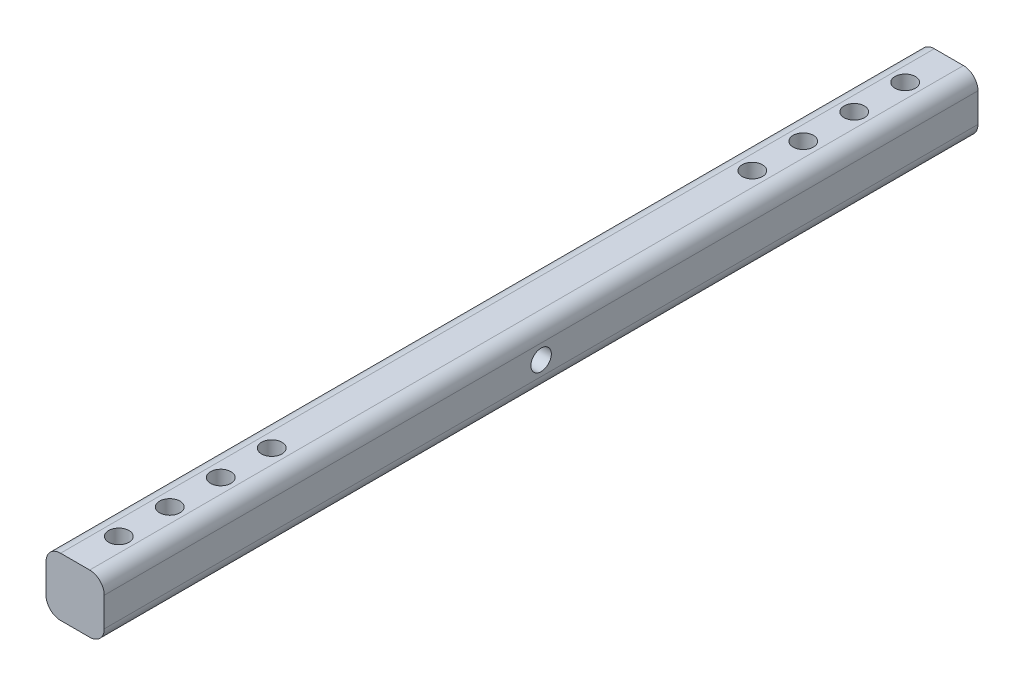
ISO-10303-21;
HEADER;
FILE_DESCRIPTION(('STEP AP214'),'2;1');
FILE_NAME('part.step','',(''),(''),'','','');
FILE_SCHEMA(('AUTOMOTIVE_DESIGN { 1 0 10303 214 1 1 1 1 }'));
ENDSEC;
DATA;
#1=APPLICATION_CONTEXT('core data for automotive mechanical design processes');
#2=APPLICATION_PROTOCOL_DEFINITION('international standard','automotive_design',2000,#1);
#3=PRODUCT_CONTEXT('',#1,'mechanical');
#4=PRODUCT('Part','Part','',(#3));
#5=PRODUCT_RELATED_PRODUCT_CATEGORY('part','',(#4));
#6=PRODUCT_DEFINITION_FORMATION('','',#4);
#7=PRODUCT_DEFINITION_CONTEXT('part definition',#1,'design');
#8=PRODUCT_DEFINITION('design','',#6,#7);
#9=PRODUCT_DEFINITION_SHAPE('','',#8);
#10=(LENGTH_UNIT() NAMED_UNIT(*) SI_UNIT(.MILLI.,.METRE.));
#11=(NAMED_UNIT(*) PLANE_ANGLE_UNIT() SI_UNIT($,.RADIAN.));
#12=(NAMED_UNIT(*) SI_UNIT($,.STERADIAN.) SOLID_ANGLE_UNIT());
#13=UNCERTAINTY_MEASURE_WITH_UNIT(LENGTH_MEASURE(1.E-05),#10,'distance_accuracy_value','');
#14=(GEOMETRIC_REPRESENTATION_CONTEXT(3) GLOBAL_UNCERTAINTY_ASSIGNED_CONTEXT((#13)) GLOBAL_UNIT_ASSIGNED_CONTEXT((#10,
#11,#12)) REPRESENTATION_CONTEXT('',''));
#15=CARTESIAN_POINT('',(0.,0.,0.));
#16=DIRECTION('',(0.,0.,1.));
#17=DIRECTION('',(1.,0.,0.));
#18=AXIS2_PLACEMENT_3D('',#15,#16,#17);
#19=CARTESIAN_POINT('',(2.,-2.,-60.));
#20=DIRECTION('',(0.,0.,1.));
#21=DIRECTION('',(1.,0.,0.));
#22=AXIS2_PLACEMENT_3D('',#19,#20,#21);
#23=PLANE('',#22);
#24=CARTESIAN_POINT('',(-2.,2.,-60.));
#25=DIRECTION('',(0.,0.,1.));
#26=DIRECTION('',(-1.,0.,0.));
#27=AXIS2_PLACEMENT_3D('',#24,#25,#26);
#28=CIRCLE('',#27,2.);
#29=CARTESIAN_POINT('',(-1.99999999999999,4.,-60.));
#30=VERTEX_POINT('',#29);
#31=CARTESIAN_POINT('',(-4.,1.99999999999999,-60.));
#32=VERTEX_POINT('',#31);
#33=EDGE_CURVE('E140',#30,#32,#28,.T.);
#34=ORIENTED_EDGE('',*,*,#33,.F.);
#35=DIRECTION('',(-1.,0.,0.));
#36=VECTOR('',#35,1.);
#37=CARTESIAN_POINT('',(-1.99999999999999,4.,-60.));
#38=LINE('',#37,#36);
#39=CARTESIAN_POINT('',(1.99999999999999,4.,-60.));
#40=VERTEX_POINT('',#39);
#41=EDGE_CURVE('E138',#40,#30,#38,.T.);
#42=ORIENTED_EDGE('',*,*,#41,.F.);
#43=CARTESIAN_POINT('',(2.,2.,-60.));
#44=DIRECTION('',(0.,0.,1.));
#45=DIRECTION('',(-1.,0.,0.));
#46=AXIS2_PLACEMENT_3D('',#43,#44,#45);
#47=CIRCLE('',#46,2.);
#48=CARTESIAN_POINT('',(4.,1.99999999999999,-60.));
#49=VERTEX_POINT('',#48);
#50=EDGE_CURVE('E136',#49,#40,#47,.T.);
#51=ORIENTED_EDGE('',*,*,#50,.F.);
#52=DIRECTION('',(0.,1.,0.));
#53=VECTOR('',#52,1.);
#54=CARTESIAN_POINT('',(4.,-1.99999999999999,-60.));
#55=LINE('',#54,#53);
#56=CARTESIAN_POINT('',(4.,-1.99999999999999,-60.));
#57=VERTEX_POINT('',#56);
#58=EDGE_CURVE('E133',#57,#49,#55,.T.);
#59=ORIENTED_EDGE('',*,*,#58,.F.);
#60=CARTESIAN_POINT('',(2.,-2.,-60.));
#61=DIRECTION('',(0.,0.,1.));
#62=DIRECTION('',(1.,0.,0.));
#63=AXIS2_PLACEMENT_3D('',#60,#61,#62);
#64=CIRCLE('',#63,2.);
#65=CARTESIAN_POINT('',(1.99999999999999,-4.,-60.));
#66=VERTEX_POINT('',#65);
#67=EDGE_CURVE('E130',#66,#57,#64,.T.);
#68=ORIENTED_EDGE('',*,*,#67,.F.);
#69=DIRECTION('',(1.,0.,0.));
#70=VECTOR('',#69,1.);
#71=CARTESIAN_POINT('',(-1.99999999999999,-4.,-60.));
#72=LINE('',#71,#70);
#73=CARTESIAN_POINT('',(-1.99999999999999,-4.,-60.));
#74=VERTEX_POINT('',#73);
#75=EDGE_CURVE('E85',#74,#66,#72,.T.);
#76=ORIENTED_EDGE('',*,*,#75,.F.);
#77=CARTESIAN_POINT('',(-2.,-2.,-60.));
#78=DIRECTION('',(0.,0.,1.));
#79=DIRECTION('',(-1.,0.,0.));
#80=AXIS2_PLACEMENT_3D('',#77,#78,#79);
#81=CIRCLE('',#80,2.);
#82=CARTESIAN_POINT('',(-4.,-2.,-60.));
#83=VERTEX_POINT('',#82);
#84=EDGE_CURVE('E79',#83,#74,#81,.T.);
#85=ORIENTED_EDGE('',*,*,#84,.F.);
#86=DIRECTION('',(0.,-1.,0.));
#87=VECTOR('',#86,1.);
#88=CARTESIAN_POINT('',(-4.,-1.99999999999999,-60.));
#89=LINE('',#88,#87);
#90=EDGE_CURVE('E120',#32,#83,#89,.T.);
#91=ORIENTED_EDGE('',*,*,#90,.F.);
#92=EDGE_LOOP('',(#34,#42,#51,#59,#68,#76,#85,#91));
#93=FACE_BOUND('',#92,.T.);
#94=ADVANCED_FACE('F33',(#93),#23,.F.);
#95=CARTESIAN_POINT('',(2.,-2.,60.));
#96=DIRECTION('',(0.,0.,-1.));
#97=DIRECTION('',(-1.,0.,0.));
#98=AXIS2_PLACEMENT_3D('',#95,#96,#97);
#99=CYLINDRICAL_SURFACE('',#98,2.);
#100=ORIENTED_EDGE('',*,*,#67,.T.);
#101=DIRECTION('',(0.,0.,-1.));
#102=VECTOR('',#101,1.);
#103=CARTESIAN_POINT('',(4.,-1.99999999999999,60.));
#104=LINE('',#103,#102);
#105=CARTESIAN_POINT('',(4.,-1.99999999999999,60.));
#106=VERTEX_POINT('',#105);
#107=EDGE_CURVE('E11',#106,#57,#104,.T.);
#108=ORIENTED_EDGE('',*,*,#107,.F.);
#109=CARTESIAN_POINT('',(2.,-2.,60.));
#110=DIRECTION('',(0.,0.,1.));
#111=DIRECTION('',(1.,0.,0.));
#112=AXIS2_PLACEMENT_3D('',#109,#110,#111);
#113=CIRCLE('',#112,2.);
#114=CARTESIAN_POINT('',(1.99999999999999,-4.,60.));
#115=VERTEX_POINT('',#114);
#116=EDGE_CURVE('E145',#115,#106,#113,.T.);
#117=ORIENTED_EDGE('',*,*,#116,.F.);
#118=DIRECTION('',(0.,0.,-1.));
#119=VECTOR('',#118,1.);
#120=CARTESIAN_POINT('',(1.99999999999999,-4.,60.));
#121=LINE('',#120,#119);
#122=EDGE_CURVE('E126',#115,#66,#121,.T.);
#123=ORIENTED_EDGE('',*,*,#122,.T.);
#124=EDGE_LOOP('',(#100,#108,#117,#123));
#125=FACE_BOUND('',#124,.T.);
#126=ADVANCED_FACE('F35',(#125),#99,.T.);
#127=CARTESIAN_POINT('',(4.,-1.99999999999999,60.));
#128=DIRECTION('',(-1.,0.,0.));
#129=DIRECTION('',(0.,0.,1.));
#130=AXIS2_PLACEMENT_3D('',#127,#128,#129);
#131=PLANE('',#130);
#132=CARTESIAN_POINT('',(4.,0.,0.));
#133=DIRECTION('',(1.,0.,0.));
#134=DIRECTION('',(0.,0.,-1.));
#135=AXIS2_PLACEMENT_3D('',#132,#133,#134);
#136=CIRCLE('',#135,1.4);
#137=CARTESIAN_POINT('',(4.,0.,-1.4));
#138=VERTEX_POINT('',#137);
#139=EDGE_CURVE('E178',#138,#138,#136,.T.);
#140=ORIENTED_EDGE('',*,*,#139,.F.);
#141=EDGE_LOOP('',(#140));
#142=FACE_BOUND('',#141,.T.);
#143=ORIENTED_EDGE('',*,*,#58,.T.);
#144=DIRECTION('',(0.,0.,-1.));
#145=VECTOR('',#144,1.);
#146=CARTESIAN_POINT('',(4.,1.99999999999999,60.));
#147=LINE('',#146,#145);
#148=CARTESIAN_POINT('',(4.,1.99999999999999,60.));
#149=VERTEX_POINT('',#148);
#150=EDGE_CURVE('E42',#149,#49,#147,.T.);
#151=ORIENTED_EDGE('',*,*,#150,.F.);
#152=DIRECTION('',(0.,1.,0.));
#153=VECTOR('',#152,1.);
#154=CARTESIAN_POINT('',(4.,-1.99999999999999,60.));
#155=LINE('',#154,#153);
#156=EDGE_CURVE('E93',#106,#149,#155,.T.);
#157=ORIENTED_EDGE('',*,*,#156,.F.);
#158=ORIENTED_EDGE('',*,*,#107,.T.);
#159=EDGE_LOOP('',(#143,#151,#157,#158));
#160=FACE_BOUND('',#159,.T.);
#161=ADVANCED_FACE('F279',(#142,#160),#131,.F.);
#162=CARTESIAN_POINT('',(2.,2.,60.));
#163=DIRECTION('',(0.,0.,-1.));
#164=DIRECTION('',(-1.,0.,0.));
#165=AXIS2_PLACEMENT_3D('',#162,#163,#164);
#166=CYLINDRICAL_SURFACE('',#165,2.);
#167=ORIENTED_EDGE('',*,*,#50,.T.);
#168=DIRECTION('',(0.,0.,-1.));
#169=VECTOR('',#168,1.);
#170=CARTESIAN_POINT('',(1.99999999999999,4.,60.));
#171=LINE('',#170,#169);
#172=CARTESIAN_POINT('',(1.99999999999999,4.,60.));
#173=VERTEX_POINT('',#172);
#174=EDGE_CURVE('E152',#173,#40,#171,.T.);
#175=ORIENTED_EDGE('',*,*,#174,.F.);
#176=CARTESIAN_POINT('',(2.,2.,60.));
#177=DIRECTION('',(0.,0.,1.));
#178=DIRECTION('',(-1.,0.,0.));
#179=AXIS2_PLACEMENT_3D('',#176,#177,#178);
#180=CIRCLE('',#179,2.);
#181=EDGE_CURVE('E160',#149,#173,#180,.T.);
#182=ORIENTED_EDGE('',*,*,#181,.F.);
#183=ORIENTED_EDGE('',*,*,#150,.T.);
#184=EDGE_LOOP('',(#167,#175,#182,#183));
#185=FACE_BOUND('',#184,.T.);
#186=ADVANCED_FACE('F158',(#185),#166,.T.);
#187=CARTESIAN_POINT('',(-1.99999999999999,4.,60.));
#188=DIRECTION('',(0.,-1.,0.));
#189=DIRECTION('',(0.,0.,-1.));
#190=AXIS2_PLACEMENT_3D('',#187,#188,#189);
#191=PLANE('',#190);
#192=ORIENTED_EDGE('',*,*,#41,.T.);
#193=DIRECTION('',(0.,0.,-1.));
#194=VECTOR('',#193,1.);
#195=CARTESIAN_POINT('',(-1.99999999999999,4.,60.));
#196=LINE('',#195,#194);
#197=CARTESIAN_POINT('',(-1.99999999999999,4.,60.));
#198=VERTEX_POINT('',#197);
#199=EDGE_CURVE('E149',#198,#30,#196,.T.);
#200=ORIENTED_EDGE('',*,*,#199,.F.);
#201=DIRECTION('',(-1.,0.,0.));
#202=VECTOR('',#201,1.);
#203=CARTESIAN_POINT('',(-1.99999999999999,4.,60.));
#204=LINE('',#203,#202);
#205=EDGE_CURVE('E172',#173,#198,#204,.T.);
#206=ORIENTED_EDGE('',*,*,#205,.F.);
#207=ORIENTED_EDGE('',*,*,#174,.T.);
#208=EDGE_LOOP('',(#192,#200,#206,#207));
#209=FACE_BOUND('',#208,.T.);
#210=CARTESIAN_POINT('',(0.,4.,33.));
#211=DIRECTION('',(0.,1.,0.));
#212=DIRECTION('',(0.,0.,1.));
#213=AXIS2_PLACEMENT_3D('',#210,#211,#212);
#214=CIRCLE('',#213,1.4);
#215=CARTESIAN_POINT('',(0.,4.,34.4));
#216=VERTEX_POINT('',#215);
#217=EDGE_CURVE('E226',#216,#216,#214,.T.);
#218=ORIENTED_EDGE('',*,*,#217,.F.);
#219=EDGE_LOOP('',(#218));
#220=FACE_BOUND('',#219,.T.);
#221=CARTESIAN_POINT('',(0.,4.,40.));
#222=DIRECTION('',(0.,1.,0.));
#223=DIRECTION('',(0.,0.,1.));
#224=AXIS2_PLACEMENT_3D('',#221,#222,#223);
#225=CIRCLE('',#224,1.4);
#226=CARTESIAN_POINT('',(0.,4.,41.4));
#227=VERTEX_POINT('',#226);
#228=EDGE_CURVE('E220',#227,#227,#225,.T.);
#229=ORIENTED_EDGE('',*,*,#228,.F.);
#230=EDGE_LOOP('',(#229));
#231=FACE_BOUND('',#230,.T.);
#232=CARTESIAN_POINT('',(0.,4.,47.));
#233=DIRECTION('',(0.,1.,0.));
#234=DIRECTION('',(0.,0.,1.));
#235=AXIS2_PLACEMENT_3D('',#232,#233,#234);
#236=CIRCLE('',#235,1.4);
#237=CARTESIAN_POINT('',(0.,4.,48.4));
#238=VERTEX_POINT('',#237);
#239=EDGE_CURVE('E214',#238,#238,#236,.T.);
#240=ORIENTED_EDGE('',*,*,#239,.F.);
#241=EDGE_LOOP('',(#240));
#242=FACE_BOUND('',#241,.T.);
#243=CARTESIAN_POINT('',(0.,4.,-33.));
#244=DIRECTION('',(0.,-1.,0.));
#245=DIRECTION('',(0.,0.,-1.));
#246=AXIS2_PLACEMENT_3D('',#243,#244,#245);
#247=CIRCLE('',#246,1.4);
#248=CARTESIAN_POINT('',(0.,4.,-34.4));
#249=VERTEX_POINT('',#248);
#250=EDGE_CURVE('E208',#249,#249,#247,.T.);
#251=ORIENTED_EDGE('',*,*,#250,.T.);
#252=EDGE_LOOP('',(#251));
#253=FACE_BOUND('',#252,.T.);
#254=CARTESIAN_POINT('',(0.,4.,-40.));
#255=DIRECTION('',(0.,-1.,0.));
#256=DIRECTION('',(0.,0.,-1.));
#257=AXIS2_PLACEMENT_3D('',#254,#255,#256);
#258=CIRCLE('',#257,1.4);
#259=CARTESIAN_POINT('',(0.,4.,-41.4));
#260=VERTEX_POINT('',#259);
#261=EDGE_CURVE('E202',#260,#260,#258,.T.);
#262=ORIENTED_EDGE('',*,*,#261,.T.);
#263=EDGE_LOOP('',(#262));
#264=FACE_BOUND('',#263,.T.);
#265=CARTESIAN_POINT('',(0.,4.,-47.));
#266=DIRECTION('',(0.,-1.,0.));
#267=DIRECTION('',(0.,0.,-1.));
#268=AXIS2_PLACEMENT_3D('',#265,#266,#267);
#269=CIRCLE('',#268,1.4);
#270=CARTESIAN_POINT('',(0.,4.,-48.4));
#271=VERTEX_POINT('',#270);
#272=EDGE_CURVE('E196',#271,#271,#269,.T.);
#273=ORIENTED_EDGE('',*,*,#272,.T.);
#274=EDGE_LOOP('',(#273));
#275=FACE_BOUND('',#274,.T.);
#276=CARTESIAN_POINT('',(0.,4.,-54.));
#277=DIRECTION('',(0.,-1.,0.));
#278=DIRECTION('',(0.,0.,-1.));
#279=AXIS2_PLACEMENT_3D('',#276,#277,#278);
#280=CIRCLE('',#279,1.4);
#281=CARTESIAN_POINT('',(0.,4.,-55.4));
#282=VERTEX_POINT('',#281);
#283=EDGE_CURVE('E190',#282,#282,#280,.T.);
#284=ORIENTED_EDGE('',*,*,#283,.T.);
#285=EDGE_LOOP('',(#284));
#286=FACE_BOUND('',#285,.T.);
#287=CARTESIAN_POINT('',(0.,4.,54.));
#288=DIRECTION('',(0.,1.,0.));
#289=DIRECTION('',(0.,0.,1.));
#290=AXIS2_PLACEMENT_3D('',#287,#288,#289);
#291=CIRCLE('',#290,1.4);
#292=CARTESIAN_POINT('',(0.,4.,55.4));
#293=VERTEX_POINT('',#292);
#294=EDGE_CURVE('E184',#293,#293,#291,.T.);
#295=ORIENTED_EDGE('',*,*,#294,.F.);
#296=EDGE_LOOP('',(#295));
#297=FACE_BOUND('',#296,.T.);
#298=ADVANCED_FACE('F167',(#209,#220,#231,#242,#253,#264,#275,#286,#297),#191,.F.);
#299=CARTESIAN_POINT('',(-2.,2.,60.));
#300=DIRECTION('',(0.,0.,-1.));
#301=DIRECTION('',(-1.,0.,0.));
#302=AXIS2_PLACEMENT_3D('',#299,#300,#301);
#303=CYLINDRICAL_SURFACE('',#302,2.);
#304=ORIENTED_EDGE('',*,*,#33,.T.);
#305=DIRECTION('',(0.,0.,-1.));
#306=VECTOR('',#305,1.);
#307=CARTESIAN_POINT('',(-4.,1.99999999999999,60.));
#308=LINE('',#307,#306);
#309=CARTESIAN_POINT('',(-4.,1.99999999999999,60.));
#310=VERTEX_POINT('',#309);
#311=EDGE_CURVE('E121',#310,#32,#308,.T.);
#312=ORIENTED_EDGE('',*,*,#311,.F.);
#313=CARTESIAN_POINT('',(-2.,2.,60.));
#314=DIRECTION('',(0.,0.,1.));
#315=DIRECTION('',(-1.,0.,0.));
#316=AXIS2_PLACEMENT_3D('',#313,#314,#315);
#317=CIRCLE('',#316,2.);
#318=EDGE_CURVE('E112',#198,#310,#317,.T.);
#319=ORIENTED_EDGE('',*,*,#318,.F.);
#320=ORIENTED_EDGE('',*,*,#199,.T.);
#321=EDGE_LOOP('',(#304,#312,#319,#320));
#322=FACE_BOUND('',#321,.T.);
#323=ADVANCED_FACE('F171',(#322),#303,.T.);
#324=CARTESIAN_POINT('',(-4.,-1.99999999999999,60.));
#325=DIRECTION('',(1.,0.,0.));
#326=DIRECTION('',(0.,0.,-1.));
#327=AXIS2_PLACEMENT_3D('',#324,#325,#326);
#328=PLANE('',#327);
#329=CARTESIAN_POINT('',(-4.,0.,0.));
#330=DIRECTION('',(1.,0.,0.));
#331=DIRECTION('',(0.,0.,-1.));
#332=AXIS2_PLACEMENT_3D('',#329,#330,#331);
#333=CIRCLE('',#332,1.4);
#334=CARTESIAN_POINT('',(-4.,0.,-1.4));
#335=VERTEX_POINT('',#334);
#336=EDGE_CURVE('E134',#335,#335,#333,.T.);
#337=ORIENTED_EDGE('',*,*,#336,.T.);
#338=EDGE_LOOP('',(#337));
#339=FACE_BOUND('',#338,.T.);
#340=ORIENTED_EDGE('',*,*,#90,.T.);
#341=DIRECTION('',(0.,0.,-1.));
#342=VECTOR('',#341,1.);
#343=CARTESIAN_POINT('',(-4.,-2.,60.));
#344=LINE('',#343,#342);
#345=CARTESIAN_POINT('',(-4.,-2.,60.));
#346=VERTEX_POINT('',#345);
#347=EDGE_CURVE('E117',#346,#83,#344,.T.);
#348=ORIENTED_EDGE('',*,*,#347,.F.);
#349=DIRECTION('',(0.,-1.,0.));
#350=VECTOR('',#349,1.);
#351=CARTESIAN_POINT('',(-4.,-1.99999999999999,60.));
#352=LINE('',#351,#350);
#353=EDGE_CURVE('E106',#310,#346,#352,.T.);
#354=ORIENTED_EDGE('',*,*,#353,.F.);
#355=ORIENTED_EDGE('',*,*,#311,.T.);
#356=EDGE_LOOP('',(#340,#348,#354,#355));
#357=FACE_BOUND('',#356,.T.);
#358=ADVANCED_FACE('F118',(#339,#357),#328,.F.);
#359=CARTESIAN_POINT('',(-2.,-2.,60.));
#360=DIRECTION('',(0.,0.,-1.));
#361=DIRECTION('',(-1.,0.,0.));
#362=AXIS2_PLACEMENT_3D('',#359,#360,#361);
#363=CYLINDRICAL_SURFACE('',#362,2.);
#364=ORIENTED_EDGE('',*,*,#84,.T.);
#365=DIRECTION('',(0.,0.,-1.));
#366=VECTOR('',#365,1.);
#367=CARTESIAN_POINT('',(-1.99999999999999,-4.,60.));
#368=LINE('',#367,#366);
#369=CARTESIAN_POINT('',(-1.99999999999999,-4.,60.));
#370=VERTEX_POINT('',#369);
#371=EDGE_CURVE('E122',#370,#74,#368,.T.);
#372=ORIENTED_EDGE('',*,*,#371,.F.);
#373=CARTESIAN_POINT('',(-2.,-2.,60.));
#374=DIRECTION('',(0.,0.,1.));
#375=DIRECTION('',(-1.,0.,0.));
#376=AXIS2_PLACEMENT_3D('',#373,#374,#375);
#377=CIRCLE('',#376,2.);
#378=EDGE_CURVE('E110',#346,#370,#377,.T.);
#379=ORIENTED_EDGE('',*,*,#378,.F.);
#380=ORIENTED_EDGE('',*,*,#347,.T.);
#381=EDGE_LOOP('',(#364,#372,#379,#380));
#382=FACE_BOUND('',#381,.T.);
#383=ADVANCED_FACE('F124',(#382),#363,.T.);
#384=CARTESIAN_POINT('',(-1.99999999999999,-4.,60.));
#385=DIRECTION('',(0.,1.,0.));
#386=DIRECTION('',(0.,0.,1.));
#387=AXIS2_PLACEMENT_3D('',#384,#385,#386);
#388=PLANE('',#387);
#389=ORIENTED_EDGE('',*,*,#75,.T.);
#390=ORIENTED_EDGE('',*,*,#122,.F.);
#391=DIRECTION('',(1.,0.,0.));
#392=VECTOR('',#391,1.);
#393=CARTESIAN_POINT('',(-1.99999999999999,-4.,60.));
#394=LINE('',#393,#392);
#395=EDGE_CURVE('E50',#370,#115,#394,.T.);
#396=ORIENTED_EDGE('',*,*,#395,.F.);
#397=ORIENTED_EDGE('',*,*,#371,.T.);
#398=EDGE_LOOP('',(#389,#390,#396,#397));
#399=FACE_BOUND('',#398,.T.);
#400=CARTESIAN_POINT('',(0.,-4.,33.));
#401=DIRECTION('',(0.,1.,0.));
#402=DIRECTION('',(0.,0.,1.));
#403=AXIS2_PLACEMENT_3D('',#400,#401,#402);
#404=CIRCLE('',#403,1.4);
#405=CARTESIAN_POINT('',(0.,-4.,34.4));
#406=VERTEX_POINT('',#405);
#407=EDGE_CURVE('E223',#406,#406,#404,.T.);
#408=ORIENTED_EDGE('',*,*,#407,.T.);
#409=EDGE_LOOP('',(#408));
#410=FACE_BOUND('',#409,.T.);
#411=CARTESIAN_POINT('',(0.,-4.,40.));
#412=DIRECTION('',(0.,1.,0.));
#413=DIRECTION('',(0.,0.,1.));
#414=AXIS2_PLACEMENT_3D('',#411,#412,#413);
#415=CIRCLE('',#414,1.4);
#416=CARTESIAN_POINT('',(0.,-4.,41.4));
#417=VERTEX_POINT('',#416);
#418=EDGE_CURVE('E217',#417,#417,#415,.T.);
#419=ORIENTED_EDGE('',*,*,#418,.T.);
#420=EDGE_LOOP('',(#419));
#421=FACE_BOUND('',#420,.T.);
#422=CARTESIAN_POINT('',(0.,-4.,47.));
#423=DIRECTION('',(0.,1.,0.));
#424=DIRECTION('',(0.,0.,1.));
#425=AXIS2_PLACEMENT_3D('',#422,#423,#424);
#426=CIRCLE('',#425,1.4);
#427=CARTESIAN_POINT('',(0.,-4.,48.4));
#428=VERTEX_POINT('',#427);
#429=EDGE_CURVE('E211',#428,#428,#426,.T.);
#430=ORIENTED_EDGE('',*,*,#429,.T.);
#431=EDGE_LOOP('',(#430));
#432=FACE_BOUND('',#431,.T.);
#433=CARTESIAN_POINT('',(0.,-4.,-33.));
#434=DIRECTION('',(0.,-1.,0.));
#435=DIRECTION('',(0.,0.,-1.));
#436=AXIS2_PLACEMENT_3D('',#433,#434,#435);
#437=CIRCLE('',#436,1.4);
#438=CARTESIAN_POINT('',(0.,-4.,-34.4));
#439=VERTEX_POINT('',#438);
#440=EDGE_CURVE('E205',#439,#439,#437,.T.);
#441=ORIENTED_EDGE('',*,*,#440,.F.);
#442=EDGE_LOOP('',(#441));
#443=FACE_BOUND('',#442,.T.);
#444=CARTESIAN_POINT('',(0.,-4.,-40.));
#445=DIRECTION('',(0.,-1.,0.));
#446=DIRECTION('',(0.,0.,-1.));
#447=AXIS2_PLACEMENT_3D('',#444,#445,#446);
#448=CIRCLE('',#447,1.4);
#449=CARTESIAN_POINT('',(0.,-4.,-41.4));
#450=VERTEX_POINT('',#449);
#451=EDGE_CURVE('E199',#450,#450,#448,.T.);
#452=ORIENTED_EDGE('',*,*,#451,.F.);
#453=EDGE_LOOP('',(#452));
#454=FACE_BOUND('',#453,.T.);
#455=CARTESIAN_POINT('',(0.,-4.,-47.));
#456=DIRECTION('',(0.,-1.,0.));
#457=DIRECTION('',(0.,0.,-1.));
#458=AXIS2_PLACEMENT_3D('',#455,#456,#457);
#459=CIRCLE('',#458,1.4);
#460=CARTESIAN_POINT('',(0.,-4.,-48.4));
#461=VERTEX_POINT('',#460);
#462=EDGE_CURVE('E193',#461,#461,#459,.T.);
#463=ORIENTED_EDGE('',*,*,#462,.F.);
#464=EDGE_LOOP('',(#463));
#465=FACE_BOUND('',#464,.T.);
#466=CARTESIAN_POINT('',(0.,-4.,-54.));
#467=DIRECTION('',(0.,-1.,0.));
#468=DIRECTION('',(0.,0.,-1.));
#469=AXIS2_PLACEMENT_3D('',#466,#467,#468);
#470=CIRCLE('',#469,1.4);
#471=CARTESIAN_POINT('',(0.,-4.,-55.4));
#472=VERTEX_POINT('',#471);
#473=EDGE_CURVE('E187',#472,#472,#470,.T.);
#474=ORIENTED_EDGE('',*,*,#473,.F.);
#475=EDGE_LOOP('',(#474));
#476=FACE_BOUND('',#475,.T.);
#477=CARTESIAN_POINT('',(0.,-4.,54.));
#478=DIRECTION('',(0.,1.,0.));
#479=DIRECTION('',(0.,0.,1.));
#480=AXIS2_PLACEMENT_3D('',#477,#478,#479);
#481=CIRCLE('',#480,1.4);
#482=CARTESIAN_POINT('',(0.,-4.,55.4));
#483=VERTEX_POINT('',#482);
#484=EDGE_CURVE('E181',#483,#483,#481,.T.);
#485=ORIENTED_EDGE('',*,*,#484,.T.);
#486=EDGE_LOOP('',(#485));
#487=FACE_BOUND('',#486,.T.);
#488=ADVANCED_FACE('F232',(#399,#410,#421,#432,#443,#454,#465,#476,#487),#388,.F.);
#489=CARTESIAN_POINT('',(2.,-2.,60.));
#490=DIRECTION('',(0.,0.,1.));
#491=DIRECTION('',(1.,0.,0.));
#492=AXIS2_PLACEMENT_3D('',#489,#490,#491);
#493=PLANE('',#492);
#494=ORIENTED_EDGE('',*,*,#395,.T.);
#495=ORIENTED_EDGE('',*,*,#116,.T.);
#496=ORIENTED_EDGE('',*,*,#156,.T.);
#497=ORIENTED_EDGE('',*,*,#181,.T.);
#498=ORIENTED_EDGE('',*,*,#205,.T.);
#499=ORIENTED_EDGE('',*,*,#318,.T.);
#500=ORIENTED_EDGE('',*,*,#353,.T.);
#501=ORIENTED_EDGE('',*,*,#378,.T.);
#502=EDGE_LOOP('',(#494,#495,#496,#497,#498,#499,#500,#501));
#503=FACE_BOUND('',#502,.T.);
#504=ADVANCED_FACE('F108',(#503),#493,.T.);
#505=CARTESIAN_POINT('',(-4.,0.,0.));
#506=DIRECTION('',(1.,0.,0.));
#507=DIRECTION('',(0.,0.,-1.));
#508=AXIS2_PLACEMENT_3D('',#505,#506,#507);
#509=CYLINDRICAL_SURFACE('',#508,1.4);
#510=ORIENTED_EDGE('',*,*,#336,.F.);
#511=EDGE_LOOP('',(#510));
#512=FACE_BOUND('',#511,.T.);
#513=ORIENTED_EDGE('',*,*,#139,.T.);
#514=EDGE_LOOP('',(#513));
#515=FACE_BOUND('',#514,.T.);
#516=ADVANCED_FACE('F261',(#512,#515),#509,.F.);
#517=CARTESIAN_POINT('',(0.,-4.,54.));
#518=DIRECTION('',(0.,1.,0.));
#519=DIRECTION('',(0.,0.,1.));
#520=AXIS2_PLACEMENT_3D('',#517,#518,#519);
#521=CYLINDRICAL_SURFACE('',#520,1.4);
#522=ORIENTED_EDGE('',*,*,#484,.F.);
#523=EDGE_LOOP('',(#522));
#524=FACE_BOUND('',#523,.T.);
#525=ORIENTED_EDGE('',*,*,#294,.T.);
#526=EDGE_LOOP('',(#525));
#527=FACE_BOUND('',#526,.T.);
#528=ADVANCED_FACE('F258',(#524,#527),#521,.F.);
#529=CARTESIAN_POINT('',(0.,-4.,-54.));
#530=DIRECTION('',(0.,1.,0.));
#531=DIRECTION('',(0.,0.,1.));
#532=AXIS2_PLACEMENT_3D('',#529,#530,#531);
#533=CYLINDRICAL_SURFACE('',#532,1.4);
#534=ORIENTED_EDGE('',*,*,#473,.T.);
#535=EDGE_LOOP('',(#534));
#536=FACE_BOUND('',#535,.T.);
#537=ORIENTED_EDGE('',*,*,#283,.F.);
#538=EDGE_LOOP('',(#537));
#539=FACE_BOUND('',#538,.T.);
#540=ADVANCED_FACE('F260',(#536,#539),#533,.F.);
#541=CARTESIAN_POINT('',(0.,-4.,-47.));
#542=DIRECTION('',(0.,1.,0.));
#543=DIRECTION('',(0.,0.,1.));
#544=AXIS2_PLACEMENT_3D('',#541,#542,#543);
#545=CYLINDRICAL_SURFACE('',#544,1.4);
#546=ORIENTED_EDGE('',*,*,#462,.T.);
#547=EDGE_LOOP('',(#546));
#548=FACE_BOUND('',#547,.T.);
#549=ORIENTED_EDGE('',*,*,#272,.F.);
#550=EDGE_LOOP('',(#549));
#551=FACE_BOUND('',#550,.T.);
#552=ADVANCED_FACE('F268',(#548,#551),#545,.F.);
#553=CARTESIAN_POINT('',(0.,-4.,-40.));
#554=DIRECTION('',(0.,1.,0.));
#555=DIRECTION('',(0.,0.,1.));
#556=AXIS2_PLACEMENT_3D('',#553,#554,#555);
#557=CYLINDRICAL_SURFACE('',#556,1.4);
#558=ORIENTED_EDGE('',*,*,#451,.T.);
#559=EDGE_LOOP('',(#558));
#560=FACE_BOUND('',#559,.T.);
#561=ORIENTED_EDGE('',*,*,#261,.F.);
#562=EDGE_LOOP('',(#561));
#563=FACE_BOUND('',#562,.T.);
#564=ADVANCED_FACE('F357',(#560,#563),#557,.F.);
#565=CARTESIAN_POINT('',(0.,-4.,-33.));
#566=DIRECTION('',(0.,1.,0.));
#567=DIRECTION('',(0.,0.,1.));
#568=AXIS2_PLACEMENT_3D('',#565,#566,#567);
#569=CYLINDRICAL_SURFACE('',#568,1.4);
#570=ORIENTED_EDGE('',*,*,#440,.T.);
#571=EDGE_LOOP('',(#570));
#572=FACE_BOUND('',#571,.T.);
#573=ORIENTED_EDGE('',*,*,#250,.F.);
#574=EDGE_LOOP('',(#573));
#575=FACE_BOUND('',#574,.T.);
#576=ADVANCED_FACE('F367',(#572,#575),#569,.F.);
#577=CARTESIAN_POINT('',(0.,-4.,47.));
#578=DIRECTION('',(0.,1.,0.));
#579=DIRECTION('',(0.,0.,1.));
#580=AXIS2_PLACEMENT_3D('',#577,#578,#579);
#581=CYLINDRICAL_SURFACE('',#580,1.4);
#582=ORIENTED_EDGE('',*,*,#429,.F.);
#583=EDGE_LOOP('',(#582));
#584=FACE_BOUND('',#583,.T.);
#585=ORIENTED_EDGE('',*,*,#239,.T.);
#586=EDGE_LOOP('',(#585));
#587=FACE_BOUND('',#586,.T.);
#588=ADVANCED_FACE('F377',(#584,#587),#581,.F.);
#589=CARTESIAN_POINT('',(0.,-4.,40.));
#590=DIRECTION('',(0.,1.,0.));
#591=DIRECTION('',(0.,0.,1.));
#592=AXIS2_PLACEMENT_3D('',#589,#590,#591);
#593=CYLINDRICAL_SURFACE('',#592,1.4);
#594=ORIENTED_EDGE('',*,*,#418,.F.);
#595=EDGE_LOOP('',(#594));
#596=FACE_BOUND('',#595,.T.);
#597=ORIENTED_EDGE('',*,*,#228,.T.);
#598=EDGE_LOOP('',(#597));
#599=FACE_BOUND('',#598,.T.);
#600=ADVANCED_FACE('F238',(#596,#599),#593,.F.);
#601=CARTESIAN_POINT('',(0.,-4.,33.));
#602=DIRECTION('',(0.,1.,0.));
#603=DIRECTION('',(0.,0.,1.));
#604=AXIS2_PLACEMENT_3D('',#601,#602,#603);
#605=CYLINDRICAL_SURFACE('',#604,1.4);
#606=ORIENTED_EDGE('',*,*,#407,.F.);
#607=EDGE_LOOP('',(#606));
#608=FACE_BOUND('',#607,.T.);
#609=ORIENTED_EDGE('',*,*,#217,.T.);
#610=EDGE_LOOP('',(#609));
#611=FACE_BOUND('',#610,.T.);
#612=ADVANCED_FACE('F235',(#608,#611),#605,.F.);
#613=CLOSED_SHELL('',(#94,#126,#161,#186,#298,#323,#358,#383,#488,#504,#516,#528,#540,#552,#564,
#576,#588,#600,#612));
#614=MANIFOLD_SOLID_BREP('B2',#613);
#615=ADVANCED_BREP_SHAPE_REPRESENTATION('',(#18,#614),#14);
#616=SHAPE_DEFINITION_REPRESENTATION(#9,#615);
ENDSEC;
END-ISO-10303-21;
